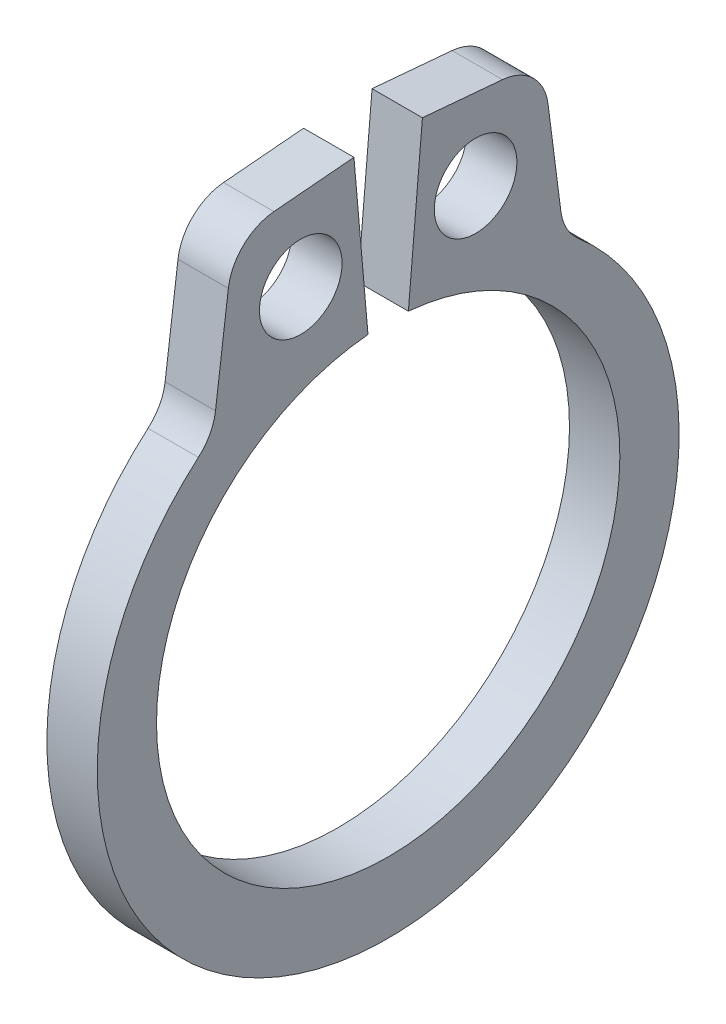
ISO-10303-21;
HEADER;
FILE_DESCRIPTION(('STEP AP214'),'2;1');
FILE_NAME('part.step','',(''),(''),'','','');
FILE_SCHEMA(('AUTOMOTIVE_DESIGN { 1 0 10303 214 1 1 1 1 }'));
ENDSEC;
DATA;
#1=APPLICATION_CONTEXT('core data for automotive mechanical design processes');
#2=APPLICATION_PROTOCOL_DEFINITION('international standard','automotive_design',2000,#1);
#3=PRODUCT_CONTEXT('',#1,'mechanical');
#4=PRODUCT('Part','Part','',(#3));
#5=PRODUCT_RELATED_PRODUCT_CATEGORY('part','',(#4));
#6=PRODUCT_DEFINITION_FORMATION('','',#4);
#7=PRODUCT_DEFINITION_CONTEXT('part definition',#1,'design');
#8=PRODUCT_DEFINITION('design','',#6,#7);
#9=PRODUCT_DEFINITION_SHAPE('','',#8);
#10=(LENGTH_UNIT() NAMED_UNIT(*) SI_UNIT(.MILLI.,.METRE.));
#11=(NAMED_UNIT(*) PLANE_ANGLE_UNIT() SI_UNIT($,.RADIAN.));
#12=(NAMED_UNIT(*) SI_UNIT($,.STERADIAN.) SOLID_ANGLE_UNIT());
#13=UNCERTAINTY_MEASURE_WITH_UNIT(LENGTH_MEASURE(1.E-05),#10,'distance_accuracy_value','');
#14=(GEOMETRIC_REPRESENTATION_CONTEXT(3) GLOBAL_UNCERTAINTY_ASSIGNED_CONTEXT((#13)) GLOBAL_UNIT_ASSIGNED_CONTEXT((#10,
#11,#12)) REPRESENTATION_CONTEXT('',''));
#15=CARTESIAN_POINT('',(0.,0.,0.));
#16=DIRECTION('',(0.,0.,1.));
#17=DIRECTION('',(1.,0.,0.));
#18=AXIS2_PLACEMENT_3D('',#15,#16,#17);
#19=CARTESIAN_POINT('',(0.3175,0.,0.));
#20=DIRECTION('',(1.,0.,0.));
#21=DIRECTION('',(0.,0.,-1.));
#22=AXIS2_PLACEMENT_3D('',#19,#20,#21);
#23=PLANE('',#22);
#24=CARTESIAN_POINT('',(0.3175,3.85560585041349,1.10223251914344));
#25=DIRECTION('',(1.,0.,0.));
#26=DIRECTION('',(0.,0.,-1.));
#27=AXIS2_PLACEMENT_3D('',#24,#25,#26);
#28=CIRCLE('',#27,0.5207);
#29=CARTESIAN_POINT('',(0.3175,3.85560585041349,0.581532519143441));
#30=VERTEX_POINT('',#29);
#31=EDGE_CURVE('E221',#30,#30,#28,.T.);
#32=ORIENTED_EDGE('',*,*,#31,.F.);
#33=EDGE_LOOP('',(#32));
#34=FACE_BOUND('',#33,.T.);
#35=DIRECTION('',(0.,-0.0871557427476581,0.996194698091745));
#36=VECTOR('',#35,1.);
#37=CARTESIAN_POINT('',(0.3175,4.93415233964842,0.431682393829152));
#38=LINE('',#37,#36);
#39=CARTESIAN_POINT('',(0.3175,4.93415233964842,0.431682393829152));
#40=VERTEX_POINT('',#39);
#41=CARTESIAN_POINT('',(0.3175,4.84586515186069,1.44080956790658));
#42=VERTEX_POINT('',#41);
#43=EDGE_CURVE('E133',#40,#42,#38,.T.);
#44=ORIENTED_EDGE('',*,*,#43,.T.);
#45=CARTESIAN_POINT('',(0.3175,4.21328151857243,1.38546567126182));
#46=DIRECTION('',(1.,0.,0.));
#47=DIRECTION('',(0.,0.,-1.));
#48=AXIS2_PLACEMENT_3D('',#45,#46,#47);
#49=CIRCLE('',#48,0.635);
#50=CARTESIAN_POINT('',(0.3175,4.2945067237745,2.01524933732492));
#51=VERTEX_POINT('',#50);
#52=EDGE_CURVE('E174',#42,#51,#49,.T.);
#53=ORIENTED_EDGE('',*,*,#52,.T.);
#54=DIRECTION('',(0.,-0.991785300886776,0.127913708979639));
#55=VECTOR('',#54,1.);
#56=CARTESIAN_POINT('',(0.3175,4.80132698770098,1.94988311372097));
#57=LINE('',#56,#55);
#58=CARTESIAN_POINT('',(0.3175,3.03853740820642,2.17723570007429));
#59=VERTEX_POINT('',#58);
#60=EDGE_CURVE('E213',#51,#59,#57,.T.);
#61=ORIENTED_EDGE('',*,*,#60,.T.);
#62=CARTESIAN_POINT('',(0.3175,3.11976261340849,2.80701936613739));
#63=DIRECTION('',(1.,0.,0.));
#64=DIRECTION('',(0.,0.,-1.));
#65=AXIS2_PLACEMENT_3D('',#62,#63,#64);
#66=CIRCLE('',#65,0.635);
#67=CARTESIAN_POINT('',(0.3175,2.63846487393826,2.39280023816181));
#68=VERTEX_POINT('',#67);
#69=EDGE_CURVE('E181',#59,#68,#66,.F.);
#70=ORIENTED_EDGE('',*,*,#69,.T.);
#71=CARTESIAN_POINT('',(0.3175,-0.141825237867012,0.));
#72=DIRECTION('',(1.,0.,0.));
#73=DIRECTION('',(0.,0.,-1.));
#74=AXIS2_PLACEMENT_3D('',#71,#72,#73);
#75=CIRCLE('',#74,3.66817476213299);
#76=CARTESIAN_POINT('',(0.3175,2.63846487393826,-2.39280023816181));
#77=VERTEX_POINT('',#76);
#78=EDGE_CURVE('E206',#68,#77,#75,.T.);
#79=ORIENTED_EDGE('',*,*,#78,.T.);
#80=CARTESIAN_POINT('',(0.3175,3.11976261340849,-2.80701936613739));
#81=DIRECTION('',(1.,0.,0.));
#82=DIRECTION('',(0.,0.,-1.));
#83=AXIS2_PLACEMENT_3D('',#80,#81,#82);
#84=CIRCLE('',#83,0.635);
#85=CARTESIAN_POINT('',(0.3175,3.03853740820642,-2.17723570007429));
#86=VERTEX_POINT('',#85);
#87=EDGE_CURVE('E11',#77,#86,#84,.F.);
#88=ORIENTED_EDGE('',*,*,#87,.T.);
#89=DIRECTION('',(0.,0.991785300886776,0.127913708979639));
#90=VECTOR('',#89,1.);
#91=CARTESIAN_POINT('',(0.3175,4.80132698770098,-1.94988311372097));
#92=LINE('',#91,#90);
#93=CARTESIAN_POINT('',(0.3175,4.2945067237745,-2.01524933732492));
#94=VERTEX_POINT('',#93);
#95=EDGE_CURVE('E205',#86,#94,#92,.T.);
#96=ORIENTED_EDGE('',*,*,#95,.T.);
#97=CARTESIAN_POINT('',(0.3175,4.21328151857243,-1.38546567126182));
#98=DIRECTION('',(1.,0.,0.));
#99=DIRECTION('',(0.,0.,-1.));
#100=AXIS2_PLACEMENT_3D('',#97,#98,#99);
#101=CIRCLE('',#100,0.635);
#102=CARTESIAN_POINT('',(0.3175,4.84586515186069,-1.44080956790658));
#103=VERTEX_POINT('',#102);
#104=EDGE_CURVE('E49',#94,#103,#101,.T.);
#105=ORIENTED_EDGE('',*,*,#104,.T.);
#106=DIRECTION('',(0.,0.0871557427476581,0.996194698091745));
#107=VECTOR('',#106,1.);
#108=CARTESIAN_POINT('',(0.3175,4.93415233964842,-0.431682393829152));
#109=LINE('',#108,#107);
#110=CARTESIAN_POINT('',(0.3175,4.93415233964842,-0.431682393829152));
#111=VERTEX_POINT('',#110);
#112=EDGE_CURVE('E210',#103,#111,#109,.T.);
#113=ORIENTED_EDGE('',*,*,#112,.T.);
#114=DIRECTION('',(0.,-0.996194698091746,0.0871557427476584));
#115=VECTOR('',#114,1.);
#116=CARTESIAN_POINT('',(0.3175,2.90988471312599,-0.25458192456591));
#117=LINE('',#116,#115);
#118=CARTESIAN_POINT('',(0.3175,2.90988471312599,-0.25458192456591));
#119=VERTEX_POINT('',#118);
#120=EDGE_CURVE('E139',#111,#119,#117,.T.);
#121=ORIENTED_EDGE('',*,*,#120,.T.);
#122=CARTESIAN_POINT('',(0.3175,0.,0.));
#123=DIRECTION('',(-1.,0.,0.));
#124=DIRECTION('',(0.,0.,-1.));
#125=AXIS2_PLACEMENT_3D('',#122,#123,#124);
#126=CIRCLE('',#125,2.921);
#127=CARTESIAN_POINT('',(0.3175,2.90988471312599,0.25458192456591));
#128=VERTEX_POINT('',#127);
#129=EDGE_CURVE('E134',#119,#128,#126,.T.);
#130=ORIENTED_EDGE('',*,*,#129,.T.);
#131=DIRECTION('',(0.,0.996194698091746,0.0871557427476584));
#132=VECTOR('',#131,1.);
#133=CARTESIAN_POINT('',(0.3175,2.90988471312599,0.25458192456591));
#134=LINE('',#133,#132);
#135=EDGE_CURVE('E125',#128,#40,#134,.T.);
#136=ORIENTED_EDGE('',*,*,#135,.T.);
#137=EDGE_LOOP('',(#44,#53,#61,#70,#79,#88,#96,#105,#113,#121,#130,#136));
#138=FACE_BOUND('',#137,.T.);
#139=CARTESIAN_POINT('',(0.3175,3.85560585041349,-1.10223251914344));
#140=DIRECTION('',(1.,0.,0.));
#141=DIRECTION('',(0.,0.,-1.));
#142=AXIS2_PLACEMENT_3D('',#139,#140,#141);
#143=CIRCLE('',#142,0.5207);
#144=CARTESIAN_POINT('',(0.3175,3.85560585041349,-1.62293251914344));
#145=VERTEX_POINT('',#144);
#146=EDGE_CURVE('E247',#145,#145,#143,.T.);
#147=ORIENTED_EDGE('',*,*,#146,.F.);
#148=EDGE_LOOP('',(#147));
#149=FACE_BOUND('',#148,.T.);
#150=ADVANCED_FACE('F34',(#34,#138,#149),#23,.T.);
#151=CARTESIAN_POINT('',(-0.3175,0.,0.));
#152=DIRECTION('',(1.,0.,0.));
#153=DIRECTION('',(0.,0.,-1.));
#154=AXIS2_PLACEMENT_3D('',#151,#152,#153);
#155=PLANE('',#154);
#156=DIRECTION('',(0.,-0.991785300886776,0.127913708979639));
#157=VECTOR('',#156,1.);
#158=CARTESIAN_POINT('',(-0.3175,4.80132698770098,1.94988311372097));
#159=LINE('',#158,#157);
#160=CARTESIAN_POINT('',(-0.3175,4.2945067237745,2.01524933732492));
#161=VERTEX_POINT('',#160);
#162=CARTESIAN_POINT('',(-0.3175,3.03853740820642,2.17723570007429));
#163=VERTEX_POINT('',#162);
#164=EDGE_CURVE('E200',#161,#163,#159,.T.);
#165=ORIENTED_EDGE('',*,*,#164,.F.);
#166=CARTESIAN_POINT('',(-0.3175,4.21328151857243,1.38546567126182));
#167=DIRECTION('',(1.,0.,0.));
#168=DIRECTION('',(0.,0.,-1.));
#169=AXIS2_PLACEMENT_3D('',#166,#167,#168);
#170=CIRCLE('',#169,0.635);
#171=CARTESIAN_POINT('',(-0.3175,4.84586515186069,1.44080956790658));
#172=VERTEX_POINT('',#171);
#173=EDGE_CURVE('E170',#161,#172,#170,.F.);
#174=ORIENTED_EDGE('',*,*,#173,.T.);
#175=DIRECTION('',(0.,-0.0871557427476581,0.996194698091745));
#176=VECTOR('',#175,1.);
#177=CARTESIAN_POINT('',(-0.3175,4.93415233964842,0.431682393829152));
#178=LINE('',#177,#176);
#179=CARTESIAN_POINT('',(-0.3175,4.93415233964842,0.431682393829152));
#180=VERTEX_POINT('',#179);
#181=EDGE_CURVE('E223',#180,#172,#178,.T.);
#182=ORIENTED_EDGE('',*,*,#181,.F.);
#183=DIRECTION('',(0.,0.996194698091746,0.0871557427476584));
#184=VECTOR('',#183,1.);
#185=CARTESIAN_POINT('',(-0.3175,2.90988471312599,0.25458192456591));
#186=LINE('',#185,#184);
#187=CARTESIAN_POINT('',(-0.3175,2.90988471312599,0.25458192456591));
#188=VERTEX_POINT('',#187);
#189=EDGE_CURVE('E220',#188,#180,#186,.T.);
#190=ORIENTED_EDGE('',*,*,#189,.F.);
#191=CARTESIAN_POINT('',(-0.3175,0.,0.));
#192=DIRECTION('',(-1.,0.,0.));
#193=DIRECTION('',(0.,0.,-1.));
#194=AXIS2_PLACEMENT_3D('',#191,#192,#193);
#195=CIRCLE('',#194,2.921);
#196=CARTESIAN_POINT('',(-0.3175,2.90988471312599,-0.25458192456591));
#197=VERTEX_POINT('',#196);
#198=EDGE_CURVE('E147',#197,#188,#195,.T.);
#199=ORIENTED_EDGE('',*,*,#198,.F.);
#200=DIRECTION('',(0.,-0.996194698091746,0.0871557427476584));
#201=VECTOR('',#200,1.);
#202=CARTESIAN_POINT('',(-0.3175,2.90988471312599,-0.25458192456591));
#203=LINE('',#202,#201);
#204=CARTESIAN_POINT('',(-0.3175,4.93415233964842,-0.431682393829152));
#205=VERTEX_POINT('',#204);
#206=EDGE_CURVE('E143',#205,#197,#203,.T.);
#207=ORIENTED_EDGE('',*,*,#206,.F.);
#208=DIRECTION('',(0.,0.0871557427476581,0.996194698091745));
#209=VECTOR('',#208,1.);
#210=CARTESIAN_POINT('',(-0.3175,4.93415233964842,-0.431682393829152));
#211=LINE('',#210,#209);
#212=CARTESIAN_POINT('',(-0.3175,4.84586515186069,-1.44080956790658));
#213=VERTEX_POINT('',#212);
#214=EDGE_CURVE('E228',#213,#205,#211,.T.);
#215=ORIENTED_EDGE('',*,*,#214,.F.);
#216=CARTESIAN_POINT('',(-0.3175,4.21328151857243,-1.38546567126182));
#217=DIRECTION('',(1.,0.,0.));
#218=DIRECTION('',(0.,0.,-1.));
#219=AXIS2_PLACEMENT_3D('',#216,#217,#218);
#220=CIRCLE('',#219,0.635);
#221=CARTESIAN_POINT('',(-0.3175,4.2945067237745,-2.01524933732492));
#222=VERTEX_POINT('',#221);
#223=EDGE_CURVE('E168',#213,#222,#220,.F.);
#224=ORIENTED_EDGE('',*,*,#223,.T.);
#225=DIRECTION('',(0.,0.991785300886776,0.127913708979639));
#226=VECTOR('',#225,1.);
#227=CARTESIAN_POINT('',(-0.3175,4.80132698770098,-1.94988311372097));
#228=LINE('',#227,#226);
#229=CARTESIAN_POINT('',(-0.3175,3.03853740820642,-2.17723570007429));
#230=VERTEX_POINT('',#229);
#231=EDGE_CURVE('E191',#230,#222,#228,.T.);
#232=ORIENTED_EDGE('',*,*,#231,.F.);
#233=CARTESIAN_POINT('',(-0.3175,3.11976261340849,-2.80701936613739));
#234=DIRECTION('',(1.,0.,0.));
#235=DIRECTION('',(0.,0.,-1.));
#236=AXIS2_PLACEMENT_3D('',#233,#234,#235);
#237=CIRCLE('',#236,0.635);
#238=CARTESIAN_POINT('',(-0.3175,2.63846487393826,-2.39280023816181));
#239=VERTEX_POINT('',#238);
#240=EDGE_CURVE('E42',#230,#239,#237,.T.);
#241=ORIENTED_EDGE('',*,*,#240,.T.);
#242=CARTESIAN_POINT('',(-0.3175,-0.141825237867012,0.));
#243=DIRECTION('',(1.,0.,0.));
#244=DIRECTION('',(0.,0.,-1.));
#245=AXIS2_PLACEMENT_3D('',#242,#243,#244);
#246=CIRCLE('',#245,3.66817476213299);
#247=CARTESIAN_POINT('',(-0.3175,2.63846487393826,2.39280023816181));
#248=VERTEX_POINT('',#247);
#249=EDGE_CURVE('E189',#248,#239,#246,.T.);
#250=ORIENTED_EDGE('',*,*,#249,.F.);
#251=CARTESIAN_POINT('',(-0.3175,3.11976261340849,2.80701936613739));
#252=DIRECTION('',(1.,0.,0.));
#253=DIRECTION('',(0.,0.,-1.));
#254=AXIS2_PLACEMENT_3D('',#251,#252,#253);
#255=CIRCLE('',#254,0.635);
#256=EDGE_CURVE('E179',#248,#163,#255,.T.);
#257=ORIENTED_EDGE('',*,*,#256,.T.);
#258=EDGE_LOOP('',(#165,#174,#182,#190,#199,#207,#215,#224,#232,#241,#250,#257));
#259=FACE_BOUND('',#258,.T.);
#260=CARTESIAN_POINT('',(-0.3175,3.85560585041349,1.10223251914344));
#261=DIRECTION('',(1.,0.,0.));
#262=DIRECTION('',(0.,0.,-1.));
#263=AXIS2_PLACEMENT_3D('',#260,#261,#262);
#264=CIRCLE('',#263,0.5207);
#265=CARTESIAN_POINT('',(-0.3175,3.85560585041349,0.581532519143441));
#266=VERTEX_POINT('',#265);
#267=EDGE_CURVE('E244',#266,#266,#264,.T.);
#268=ORIENTED_EDGE('',*,*,#267,.T.);
#269=EDGE_LOOP('',(#268));
#270=FACE_BOUND('',#269,.T.);
#271=CARTESIAN_POINT('',(-0.3175,3.85560585041349,-1.10223251914344));
#272=DIRECTION('',(1.,0.,0.));
#273=DIRECTION('',(0.,0.,-1.));
#274=AXIS2_PLACEMENT_3D('',#271,#272,#273);
#275=CIRCLE('',#274,0.5207);
#276=CARTESIAN_POINT('',(-0.3175,3.85560585041349,-1.62293251914344));
#277=VERTEX_POINT('',#276);
#278=EDGE_CURVE('E250',#277,#277,#275,.T.);
#279=ORIENTED_EDGE('',*,*,#278,.T.);
#280=EDGE_LOOP('',(#279));
#281=FACE_BOUND('',#280,.T.);
#282=ADVANCED_FACE('F187',(#259,#270,#281),#155,.F.);
#283=CARTESIAN_POINT('',(0.3175,0.,0.));
#284=DIRECTION('',(-1.,0.,0.));
#285=DIRECTION('',(0.,0.,1.));
#286=AXIS2_PLACEMENT_3D('',#283,#284,#285);
#287=CYLINDRICAL_SURFACE('',#286,2.921);
#288=ORIENTED_EDGE('',*,*,#198,.T.);
#289=DIRECTION('',(-1.,0.,0.));
#290=VECTOR('',#289,1.);
#291=CARTESIAN_POINT('',(0.3175,2.90988471312599,0.25458192456591));
#292=LINE('',#291,#290);
#293=EDGE_CURVE('E129',#128,#188,#292,.T.);
#294=ORIENTED_EDGE('',*,*,#293,.F.);
#295=ORIENTED_EDGE('',*,*,#129,.F.);
#296=DIRECTION('',(-1.,0.,0.));
#297=VECTOR('',#296,1.);
#298=CARTESIAN_POINT('',(0.3175,2.90988471312599,-0.25458192456591));
#299=LINE('',#298,#297);
#300=EDGE_CURVE('E218',#119,#197,#299,.T.);
#301=ORIENTED_EDGE('',*,*,#300,.T.);
#302=EDGE_LOOP('',(#288,#294,#295,#301));
#303=FACE_BOUND('',#302,.T.);
#304=ADVANCED_FACE('F145',(#303),#287,.F.);
#305=CARTESIAN_POINT('',(0.3175,2.90988471312599,0.25458192456591));
#306=DIRECTION('',(0.,-0.0871557427476584,0.996194698091746));
#307=DIRECTION('',(0.,-0.996194698091746,-0.0871557427476584));
#308=AXIS2_PLACEMENT_3D('',#305,#306,#307);
#309=PLANE('',#308);
#310=ORIENTED_EDGE('',*,*,#189,.T.);
#311=DIRECTION('',(-1.,0.,0.));
#312=VECTOR('',#311,1.);
#313=CARTESIAN_POINT('',(0.3175,4.93415233964842,0.431682393829152));
#314=LINE('',#313,#312);
#315=EDGE_CURVE('E132',#40,#180,#314,.T.);
#316=ORIENTED_EDGE('',*,*,#315,.F.);
#317=ORIENTED_EDGE('',*,*,#135,.F.);
#318=ORIENTED_EDGE('',*,*,#293,.T.);
#319=EDGE_LOOP('',(#310,#316,#317,#318));
#320=FACE_BOUND('',#319,.T.);
#321=ADVANCED_FACE('F127',(#320),#309,.F.);
#322=CARTESIAN_POINT('',(0.3175,4.93415233964842,0.431682393829152));
#323=DIRECTION('',(0.,-0.996194698091746,-0.0871557427476581));
#324=DIRECTION('',(0.,0.0871557427476581,-0.996194698091746));
#325=AXIS2_PLACEMENT_3D('',#322,#323,#324);
#326=PLANE('',#325);
#327=ORIENTED_EDGE('',*,*,#181,.T.);
#328=DIRECTION('',(-1.,0.,0.));
#329=VECTOR('',#328,1.);
#330=CARTESIAN_POINT('',(0.3175,4.84586515186069,1.44080956790658));
#331=LINE('',#330,#329);
#332=EDGE_CURVE('E57',#172,#42,#331,.F.);
#333=ORIENTED_EDGE('',*,*,#332,.T.);
#334=ORIENTED_EDGE('',*,*,#43,.F.);
#335=ORIENTED_EDGE('',*,*,#315,.T.);
#336=EDGE_LOOP('',(#327,#333,#334,#335));
#337=FACE_BOUND('',#336,.T.);
#338=ADVANCED_FACE('F239',(#337),#326,.F.);
#339=CARTESIAN_POINT('',(0.3175,4.80132698770098,1.94988311372097));
#340=DIRECTION('',(0.,-0.127913708979639,-0.991785300886776));
#341=DIRECTION('',(0.,0.991785300886776,-0.127913708979639));
#342=AXIS2_PLACEMENT_3D('',#339,#340,#341);
#343=PLANE('',#342);
#344=ORIENTED_EDGE('',*,*,#164,.T.);
#345=DIRECTION('',(1.,0.,0.));
#346=VECTOR('',#345,1.);
#347=CARTESIAN_POINT('',(0.3175,3.03853740820642,2.17723570007429));
#348=LINE('',#347,#346);
#349=EDGE_CURVE('E161',#163,#59,#348,.T.);
#350=ORIENTED_EDGE('',*,*,#349,.T.);
#351=ORIENTED_EDGE('',*,*,#60,.F.);
#352=DIRECTION('',(-1.,0.,0.));
#353=VECTOR('',#352,1.);
#354=CARTESIAN_POINT('',(0.3175,4.2945067237745,2.01524933732492));
#355=LINE('',#354,#353);
#356=EDGE_CURVE('E158',#51,#161,#355,.T.);
#357=ORIENTED_EDGE('',*,*,#356,.T.);
#358=EDGE_LOOP('',(#344,#350,#351,#357));
#359=FACE_BOUND('',#358,.T.);
#360=ADVANCED_FACE('F279',(#359),#343,.F.);
#361=CARTESIAN_POINT('',(0.3175,-0.141825237867012,0.));
#362=DIRECTION('',(-1.,0.,0.));
#363=DIRECTION('',(0.,0.,1.));
#364=AXIS2_PLACEMENT_3D('',#361,#362,#363);
#365=CYLINDRICAL_SURFACE('',#364,3.66817476213299);
#366=ORIENTED_EDGE('',*,*,#78,.F.);
#367=DIRECTION('',(-1.,0.,0.));
#368=VECTOR('',#367,1.);
#369=CARTESIAN_POINT('',(0.3175,2.63846487393826,2.39280023816181));
#370=LINE('',#369,#368);
#371=EDGE_CURVE('E150',#68,#248,#370,.T.);
#372=ORIENTED_EDGE('',*,*,#371,.T.);
#373=ORIENTED_EDGE('',*,*,#249,.T.);
#374=DIRECTION('',(-1.,0.,0.));
#375=VECTOR('',#374,1.);
#376=CARTESIAN_POINT('',(0.3175,2.63846487393826,-2.39280023816181));
#377=LINE('',#376,#375);
#378=EDGE_CURVE('E148',#239,#77,#377,.F.);
#379=ORIENTED_EDGE('',*,*,#378,.T.);
#380=EDGE_LOOP('',(#366,#372,#373,#379));
#381=FACE_BOUND('',#380,.T.);
#382=ADVANCED_FACE('F197',(#381),#365,.T.);
#383=CARTESIAN_POINT('',(0.3175,4.80132698770098,-1.94988311372097));
#384=DIRECTION('',(0.,-0.127913708979639,0.991785300886776));
#385=DIRECTION('',(0.,-0.991785300886776,-0.127913708979639));
#386=AXIS2_PLACEMENT_3D('',#383,#384,#385);
#387=PLANE('',#386);
#388=ORIENTED_EDGE('',*,*,#95,.F.);
#389=DIRECTION('',(1.,0.,0.));
#390=VECTOR('',#389,1.);
#391=CARTESIAN_POINT('',(-0.3175,3.03853740820642,-2.17723570007429));
#392=LINE('',#391,#390);
#393=EDGE_CURVE('E165',#86,#230,#392,.F.);
#394=ORIENTED_EDGE('',*,*,#393,.T.);
#395=ORIENTED_EDGE('',*,*,#231,.T.);
#396=DIRECTION('',(-1.,0.,0.));
#397=VECTOR('',#396,1.);
#398=CARTESIAN_POINT('',(0.3175,4.2945067237745,-2.01524933732492));
#399=LINE('',#398,#397);
#400=EDGE_CURVE('E163',#222,#94,#399,.F.);
#401=ORIENTED_EDGE('',*,*,#400,.T.);
#402=EDGE_LOOP('',(#388,#394,#395,#401));
#403=FACE_BOUND('',#402,.T.);
#404=ADVANCED_FACE('F208',(#403),#387,.F.);
#405=CARTESIAN_POINT('',(0.3175,4.93415233964842,-0.431682393829152));
#406=DIRECTION('',(0.,-0.996194698091746,0.0871557427476581));
#407=DIRECTION('',(0.,-0.0871557427476581,-0.996194698091746));
#408=AXIS2_PLACEMENT_3D('',#405,#406,#407);
#409=PLANE('',#408);
#410=ORIENTED_EDGE('',*,*,#112,.F.);
#411=DIRECTION('',(-1.,0.,0.));
#412=VECTOR('',#411,1.);
#413=CARTESIAN_POINT('',(0.3175,4.84586515186069,-1.44080956790658));
#414=LINE('',#413,#412);
#415=EDGE_CURVE('E176',#103,#213,#414,.T.);
#416=ORIENTED_EDGE('',*,*,#415,.T.);
#417=ORIENTED_EDGE('',*,*,#214,.T.);
#418=DIRECTION('',(-1.,0.,0.));
#419=VECTOR('',#418,1.);
#420=CARTESIAN_POINT('',(0.3175,4.93415233964842,-0.431682393829152));
#421=LINE('',#420,#419);
#422=EDGE_CURVE('E152',#111,#205,#421,.T.);
#423=ORIENTED_EDGE('',*,*,#422,.F.);
#424=EDGE_LOOP('',(#410,#416,#417,#423));
#425=FACE_BOUND('',#424,.T.);
#426=ADVANCED_FACE('F272',(#425),#409,.F.);
#427=CARTESIAN_POINT('',(0.3175,2.90988471312599,-0.25458192456591));
#428=DIRECTION('',(0.,-0.0871557427476584,-0.996194698091746));
#429=DIRECTION('',(0.,0.996194698091746,-0.0871557427476584));
#430=AXIS2_PLACEMENT_3D('',#427,#428,#429);
#431=PLANE('',#430);
#432=ORIENTED_EDGE('',*,*,#206,.T.);
#433=ORIENTED_EDGE('',*,*,#300,.F.);
#434=ORIENTED_EDGE('',*,*,#120,.F.);
#435=ORIENTED_EDGE('',*,*,#422,.T.);
#436=EDGE_LOOP('',(#432,#433,#434,#435));
#437=FACE_BOUND('',#436,.T.);
#438=ADVANCED_FACE('F235',(#437),#431,.F.);
#439=CARTESIAN_POINT('',(0.3175,3.85560585041349,1.10223251914344));
#440=DIRECTION('',(-1.,0.,0.));
#441=DIRECTION('',(0.,0.,1.));
#442=AXIS2_PLACEMENT_3D('',#439,#440,#441);
#443=CYLINDRICAL_SURFACE('',#442,0.5207);
#444=ORIENTED_EDGE('',*,*,#31,.T.);
#445=EDGE_LOOP('',(#444));
#446=FACE_BOUND('',#445,.T.);
#447=ORIENTED_EDGE('',*,*,#267,.F.);
#448=EDGE_LOOP('',(#447));
#449=FACE_BOUND('',#448,.T.);
#450=ADVANCED_FACE('F267',(#446,#449),#443,.F.);
#451=CARTESIAN_POINT('',(0.3175,3.85560585041349,-1.10223251914344));
#452=DIRECTION('',(-1.,0.,0.));
#453=DIRECTION('',(0.,0.,1.));
#454=AXIS2_PLACEMENT_3D('',#451,#452,#453);
#455=CYLINDRICAL_SURFACE('',#454,0.5207);
#456=ORIENTED_EDGE('',*,*,#146,.T.);
#457=EDGE_LOOP('',(#456));
#458=FACE_BOUND('',#457,.T.);
#459=ORIENTED_EDGE('',*,*,#278,.F.);
#460=EDGE_LOOP('',(#459));
#461=FACE_BOUND('',#460,.T.);
#462=ADVANCED_FACE('F256',(#458,#461),#455,.F.);
#463=CARTESIAN_POINT('',(0.3175,3.11976261340849,2.80701936613739));
#464=DIRECTION('',(-1.,0.,0.));
#465=DIRECTION('',(0.,0.,1.));
#466=AXIS2_PLACEMENT_3D('',#463,#464,#465);
#467=CYLINDRICAL_SURFACE('',#466,0.635);
#468=ORIENTED_EDGE('',*,*,#69,.F.);
#469=ORIENTED_EDGE('',*,*,#349,.F.);
#470=ORIENTED_EDGE('',*,*,#256,.F.);
#471=ORIENTED_EDGE('',*,*,#371,.F.);
#472=EDGE_LOOP('',(#468,#469,#470,#471));
#473=FACE_BOUND('',#472,.T.);
#474=ADVANCED_FACE('F289',(#473),#467,.F.);
#475=CARTESIAN_POINT('',(0.3175,3.11976261340849,-2.80701936613739));
#476=DIRECTION('',(-1.,0.,0.));
#477=DIRECTION('',(0.,0.,1.));
#478=AXIS2_PLACEMENT_3D('',#475,#476,#477);
#479=CYLINDRICAL_SURFACE('',#478,0.635);
#480=ORIENTED_EDGE('',*,*,#87,.F.);
#481=ORIENTED_EDGE('',*,*,#378,.F.);
#482=ORIENTED_EDGE('',*,*,#240,.F.);
#483=ORIENTED_EDGE('',*,*,#393,.F.);
#484=EDGE_LOOP('',(#480,#481,#482,#483));
#485=FACE_BOUND('',#484,.T.);
#486=ADVANCED_FACE('F203',(#485),#479,.F.);
#487=CARTESIAN_POINT('',(0.3175,4.21328151857243,1.38546567126182));
#488=DIRECTION('',(-1.,0.,0.));
#489=DIRECTION('',(0.,0.,1.));
#490=AXIS2_PLACEMENT_3D('',#487,#488,#489);
#491=CYLINDRICAL_SURFACE('',#490,0.635);
#492=ORIENTED_EDGE('',*,*,#52,.F.);
#493=ORIENTED_EDGE('',*,*,#332,.F.);
#494=ORIENTED_EDGE('',*,*,#173,.F.);
#495=ORIENTED_EDGE('',*,*,#356,.F.);
#496=EDGE_LOOP('',(#492,#493,#494,#495));
#497=FACE_BOUND('',#496,.T.);
#498=ADVANCED_FACE('F294',(#497),#491,.T.);
#499=CARTESIAN_POINT('',(0.3175,4.21328151857243,-1.38546567126182));
#500=DIRECTION('',(-1.,0.,0.));
#501=DIRECTION('',(0.,0.,1.));
#502=AXIS2_PLACEMENT_3D('',#499,#500,#501);
#503=CYLINDRICAL_SURFACE('',#502,0.635);
#504=ORIENTED_EDGE('',*,*,#104,.F.);
#505=ORIENTED_EDGE('',*,*,#400,.F.);
#506=ORIENTED_EDGE('',*,*,#223,.F.);
#507=ORIENTED_EDGE('',*,*,#415,.F.);
#508=EDGE_LOOP('',(#504,#505,#506,#507));
#509=FACE_BOUND('',#508,.T.);
#510=ADVANCED_FACE('F36',(#509),#503,.T.);
#511=CLOSED_SHELL('',(#150,#282,#304,#321,#338,#360,#382,#404,#426,#438,#450,#462,#474,#486,
#498,#510));
#512=MANIFOLD_SOLID_BREP('B2',#511);
#513=ADVANCED_BREP_SHAPE_REPRESENTATION('',(#18,#512),#14);
#514=SHAPE_DEFINITION_REPRESENTATION(#9,#513);
ENDSEC;
END-ISO-10303-21;
